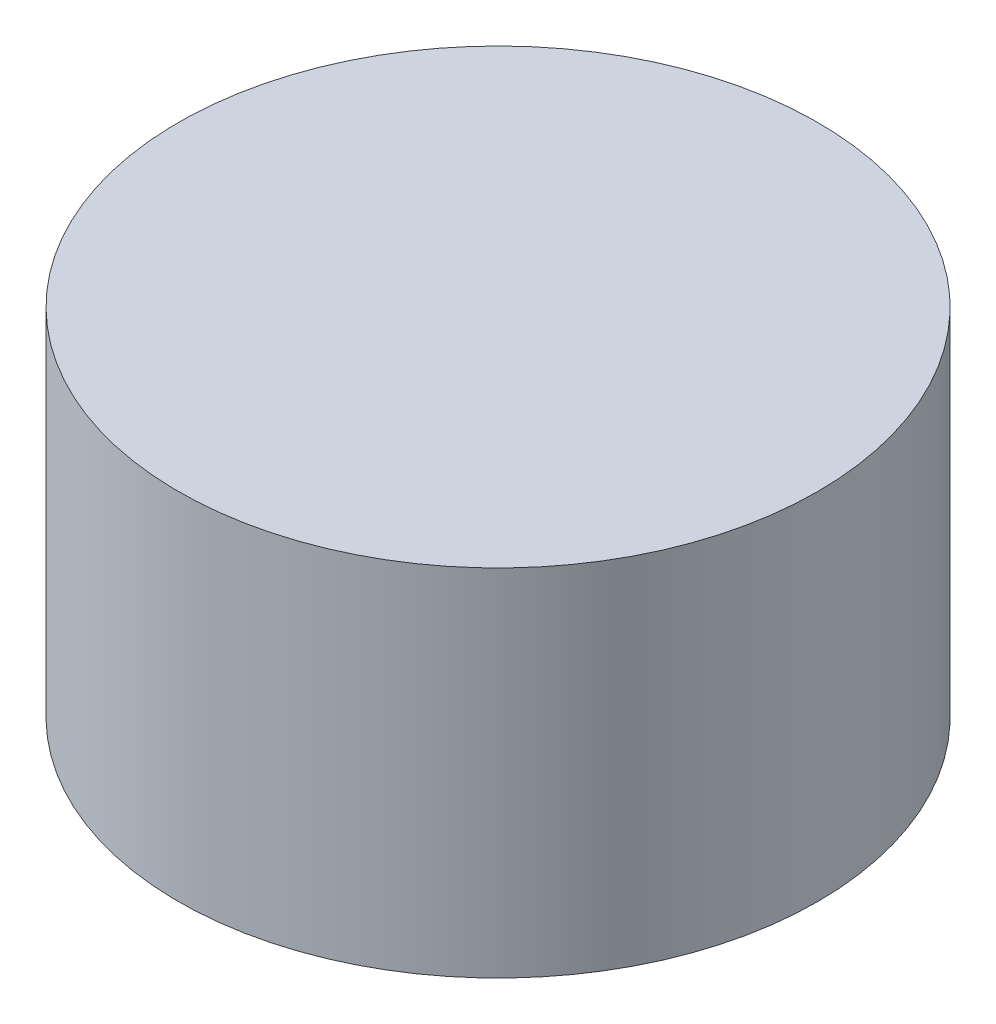
ISO-10303-21;
HEADER;
FILE_DESCRIPTION(('STEP AP214'),'2;1');
FILE_NAME('part.step','',(''),(''),'','','');
FILE_SCHEMA(('AUTOMOTIVE_DESIGN { 1 0 10303 214 1 1 1 1 }'));
ENDSEC;
DATA;
#1=APPLICATION_CONTEXT('core data for automotive mechanical design processes');
#2=APPLICATION_PROTOCOL_DEFINITION('international standard','automotive_design',2000,#1);
#3=PRODUCT_CONTEXT('',#1,'mechanical');
#4=PRODUCT('Part','Part','',(#3));
#5=PRODUCT_RELATED_PRODUCT_CATEGORY('part','',(#4));
#6=PRODUCT_DEFINITION_FORMATION('','',#4);
#7=PRODUCT_DEFINITION_CONTEXT('part definition',#1,'design');
#8=PRODUCT_DEFINITION('design','',#6,#7);
#9=PRODUCT_DEFINITION_SHAPE('','',#8);
#10=(LENGTH_UNIT() NAMED_UNIT(*) SI_UNIT(.MILLI.,.METRE.));
#11=(NAMED_UNIT(*) PLANE_ANGLE_UNIT() SI_UNIT($,.RADIAN.));
#12=(NAMED_UNIT(*) SI_UNIT($,.STERADIAN.) SOLID_ANGLE_UNIT());
#13=UNCERTAINTY_MEASURE_WITH_UNIT(LENGTH_MEASURE(1.E-05),#10,'distance_accuracy_value','');
#14=(GEOMETRIC_REPRESENTATION_CONTEXT(3) GLOBAL_UNCERTAINTY_ASSIGNED_CONTEXT((#13)) GLOBAL_UNIT_ASSIGNED_CONTEXT((#10,
#11,#12)) REPRESENTATION_CONTEXT('',''));
#15=CARTESIAN_POINT('',(0.,0.,0.));
#16=DIRECTION('',(0.,0.,1.));
#17=DIRECTION('',(1.,0.,0.));
#18=AXIS2_PLACEMENT_3D('',#15,#16,#17);
#19=CARTESIAN_POINT('',(0.,-54.,-10.05));
#20=DIRECTION('',(0.,-1.,0.));
#21=DIRECTION('',(1.,0.,0.));
#22=AXIS2_PLACEMENT_3D('',#19,#20,#21);
#23=PLANE('',#22);
#24=CARTESIAN_POINT('',(0.,-54.,-10.05));
#25=DIRECTION('',(0.,-1.,0.));
#26=DIRECTION('',(1.,0.,0.));
#27=AXIS2_PLACEMENT_3D('',#24,#25,#26);
#28=CIRCLE('',#27,0.9);
#29=CARTESIAN_POINT('',(0.899999999999999,-54.,-10.05));
#30=VERTEX_POINT('',#29);
#31=EDGE_CURVE('E17',#30,#30,#28,.F.);
#32=ORIENTED_EDGE('',*,*,#31,.F.);
#33=EDGE_LOOP('',(#32));
#34=FACE_BOUND('',#33,.T.);
#35=ADVANCED_FACE('F14',(#34),#23,.T.);
#36=CARTESIAN_POINT('',(0.,-53.,-10.05));
#37=DIRECTION('',(0.,-1.,0.));
#38=DIRECTION('',(1.,0.,0.));
#39=AXIS2_PLACEMENT_3D('',#36,#37,#38);
#40=PLANE('',#39);
#41=CARTESIAN_POINT('',(0.,-53.,-10.05));
#42=DIRECTION('',(0.,-1.,0.));
#43=DIRECTION('',(1.,0.,0.));
#44=AXIS2_PLACEMENT_3D('',#41,#42,#43);
#45=CIRCLE('',#44,0.9);
#46=CARTESIAN_POINT('',(0.899999999999998,-53.,-10.05));
#47=VERTEX_POINT('',#46);
#48=EDGE_CURVE('E10',#47,#47,#45,.T.);
#49=ORIENTED_EDGE('',*,*,#48,.F.);
#50=EDGE_LOOP('',(#49));
#51=FACE_BOUND('',#50,.T.);
#52=ADVANCED_FACE('F29',(#51),#40,.F.);
#53=CARTESIAN_POINT('',(0.,-54.,-10.05));
#54=DIRECTION('',(0.,-1.,0.));
#55=DIRECTION('',(1.,0.,0.));
#56=AXIS2_PLACEMENT_3D('',#53,#54,#55);
#57=CYLINDRICAL_SURFACE('',#56,0.9);
#58=ORIENTED_EDGE('',*,*,#48,.T.);
#59=EDGE_LOOP('',(#58));
#60=FACE_BOUND('',#59,.T.);
#61=ORIENTED_EDGE('',*,*,#31,.T.);
#62=EDGE_LOOP('',(#61));
#63=FACE_BOUND('',#62,.T.);
#64=ADVANCED_FACE('F26',(#60,#63),#57,.T.);
#65=CLOSED_SHELL('',(#35,#52,#64));
#66=MANIFOLD_SOLID_BREP('B1',#65);
#67=ADVANCED_BREP_SHAPE_REPRESENTATION('',(#18,#66),#14);
#68=SHAPE_DEFINITION_REPRESENTATION(#9,#67);
ENDSEC;
END-ISO-10303-21;
